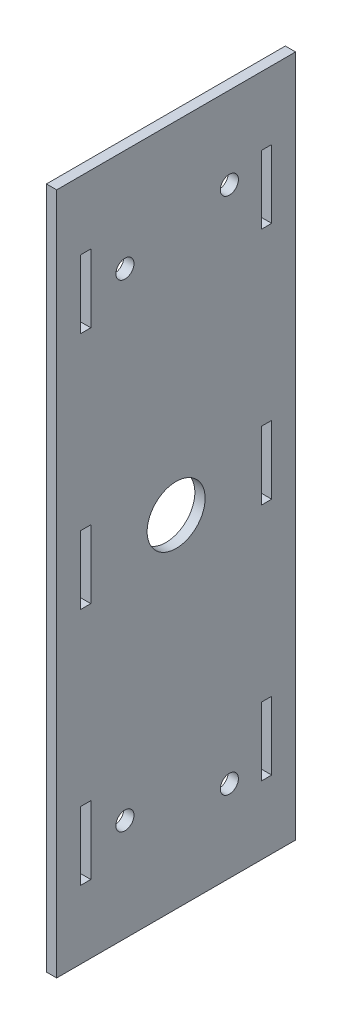
ISO-10303-21;
HEADER;
FILE_DESCRIPTION(('STEP AP214'),'2;1');
FILE_NAME('part.step','',(''),(''),'','','');
FILE_SCHEMA(('AUTOMOTIVE_DESIGN { 1 0 10303 214 1 1 1 1 }'));
ENDSEC;
DATA;
#1=APPLICATION_CONTEXT('core data for automotive mechanical design processes');
#2=APPLICATION_PROTOCOL_DEFINITION('international standard','automotive_design',2000,#1);
#3=PRODUCT_CONTEXT('',#1,'mechanical');
#4=PRODUCT('Part','Part','',(#3));
#5=PRODUCT_RELATED_PRODUCT_CATEGORY('part','',(#4));
#6=PRODUCT_DEFINITION_FORMATION('','',#4);
#7=PRODUCT_DEFINITION_CONTEXT('part definition',#1,'design');
#8=PRODUCT_DEFINITION('design','',#6,#7);
#9=PRODUCT_DEFINITION_SHAPE('','',#8);
#10=(LENGTH_UNIT() NAMED_UNIT(*) SI_UNIT(.MILLI.,.METRE.));
#11=(NAMED_UNIT(*) PLANE_ANGLE_UNIT() SI_UNIT($,.RADIAN.));
#12=(NAMED_UNIT(*) SI_UNIT($,.STERADIAN.) SOLID_ANGLE_UNIT());
#13=UNCERTAINTY_MEASURE_WITH_UNIT(LENGTH_MEASURE(1.E-05),#10,'distance_accuracy_value','');
#14=(GEOMETRIC_REPRESENTATION_CONTEXT(3) GLOBAL_UNCERTAINTY_ASSIGNED_CONTEXT((#13)) GLOBAL_UNIT_ASSIGNED_CONTEXT((#10,
#11,#12)) REPRESENTATION_CONTEXT('',''));
#15=CARTESIAN_POINT('',(0.,0.,0.));
#16=DIRECTION('',(0.,0.,1.));
#17=DIRECTION('',(1.,0.,0.));
#18=AXIS2_PLACEMENT_3D('',#15,#16,#17);
#19=CARTESIAN_POINT('',(3.,0.,0.));
#20=DIRECTION('',(1.,0.,0.));
#21=DIRECTION('',(0.,0.,-1.));
#22=AXIS2_PLACEMENT_3D('',#19,#20,#21);
#23=PLANE('',#22);
#24=CARTESIAN_POINT('',(3.,-70.,15.));
#25=DIRECTION('',(1.,0.,0.));
#26=DIRECTION('',(0.,0.,-1.));
#27=AXIS2_PLACEMENT_3D('',#24,#25,#26);
#28=CIRCLE('',#27,2.65);
#29=CARTESIAN_POINT('',(3.,-70.,12.35));
#30=VERTEX_POINT('',#29);
#31=EDGE_CURVE('E260',#30,#30,#28,.T.);
#32=ORIENTED_EDGE('',*,*,#31,.F.);
#33=EDGE_LOOP('',(#32));
#34=FACE_BOUND('',#33,.T.);
#35=DIRECTION('',(0.,1.,0.));
#36=VECTOR('',#35,1.);
#37=CARTESIAN_POINT('',(3.,-80.,-28.));
#38=LINE('',#37,#36);
#39=CARTESIAN_POINT('',(3.,-80.,-28.));
#40=VERTEX_POINT('',#39);
#41=CARTESIAN_POINT('',(3.,-60.,-28.));
#42=VERTEX_POINT('',#41);
#43=EDGE_CURVE('E397',#40,#42,#38,.T.);
#44=ORIENTED_EDGE('',*,*,#43,.F.);
#45=DIRECTION('',(0.,0.,-1.));
#46=VECTOR('',#45,1.);
#47=CARTESIAN_POINT('',(3.,-80.,-25.));
#48=LINE('',#47,#46);
#49=CARTESIAN_POINT('',(3.,-80.,-25.));
#50=VERTEX_POINT('',#49);
#51=EDGE_CURVE('E400',#50,#40,#48,.T.);
#52=ORIENTED_EDGE('',*,*,#51,.F.);
#53=DIRECTION('',(0.,-1.,0.));
#54=VECTOR('',#53,1.);
#55=CARTESIAN_POINT('',(3.,-80.,-25.));
#56=LINE('',#55,#54);
#57=CARTESIAN_POINT('',(3.,-60.,-25.));
#58=VERTEX_POINT('',#57);
#59=EDGE_CURVE('E403',#58,#50,#56,.T.);
#60=ORIENTED_EDGE('',*,*,#59,.F.);
#61=DIRECTION('',(0.,0.,1.));
#62=VECTOR('',#61,1.);
#63=CARTESIAN_POINT('',(3.,-60.,-25.));
#64=LINE('',#63,#62);
#65=EDGE_CURVE('E405',#42,#58,#64,.T.);
#66=ORIENTED_EDGE('',*,*,#65,.F.);
#67=EDGE_LOOP('',(#44,#52,#60,#66));
#68=FACE_BOUND('',#67,.T.);
#69=CARTESIAN_POINT('',(3.,-76.,-15.6));
#70=DIRECTION('',(1.,0.,0.));
#71=DIRECTION('',(0.,0.,-1.));
#72=AXIS2_PLACEMENT_3D('',#69,#70,#71);
#73=CIRCLE('',#72,2.65);
#74=CARTESIAN_POINT('',(3.,-76.,-18.25));
#75=VERTEX_POINT('',#74);
#76=EDGE_CURVE('E428',#75,#75,#73,.T.);
#77=ORIENTED_EDGE('',*,*,#76,.F.);
#78=EDGE_LOOP('',(#77));
#79=FACE_BOUND('',#78,.T.);
#80=DIRECTION('',(0.,0.,-1.));
#81=VECTOR('',#80,1.);
#82=CARTESIAN_POINT('',(3.,-100.,35.));
#83=LINE('',#82,#81);
#84=CARTESIAN_POINT('',(3.,-100.,35.));
#85=VERTEX_POINT('',#84);
#86=CARTESIAN_POINT('',(3.,-100.,-35.));
#87=VERTEX_POINT('',#86);
#88=EDGE_CURVE('E439',#85,#87,#83,.T.);
#89=ORIENTED_EDGE('',*,*,#88,.T.);
#90=DIRECTION('',(0.,1.,0.));
#91=VECTOR('',#90,1.);
#92=CARTESIAN_POINT('',(3.,-100.,-35.));
#93=LINE('',#92,#91);
#94=CARTESIAN_POINT('',(3.,100.,-35.));
#95=VERTEX_POINT('',#94);
#96=EDGE_CURVE('E444',#87,#95,#93,.T.);
#97=ORIENTED_EDGE('',*,*,#96,.T.);
#98=DIRECTION('',(0.,0.,1.));
#99=VECTOR('',#98,1.);
#100=CARTESIAN_POINT('',(3.,100.,35.));
#101=LINE('',#100,#99);
#102=CARTESIAN_POINT('',(3.,100.,35.));
#103=VERTEX_POINT('',#102);
#104=EDGE_CURVE('E447',#95,#103,#101,.T.);
#105=ORIENTED_EDGE('',*,*,#104,.T.);
#106=DIRECTION('',(0.,-1.,0.));
#107=VECTOR('',#106,1.);
#108=CARTESIAN_POINT('',(3.,-100.,35.));
#109=LINE('',#108,#107);
#110=EDGE_CURVE('E449',#103,#85,#109,.T.);
#111=ORIENTED_EDGE('',*,*,#110,.T.);
#112=EDGE_LOOP('',(#89,#97,#105,#111));
#113=FACE_BOUND('',#112,.T.);
#114=CARTESIAN_POINT('',(3.,0.,0.));
#115=DIRECTION('',(1.,0.,0.));
#116=DIRECTION('',(0.,0.,-1.));
#117=AXIS2_PLACEMENT_3D('',#114,#115,#116);
#118=CIRCLE('',#117,8.5);
#119=CARTESIAN_POINT('',(3.,0.,-8.5));
#120=VERTEX_POINT('',#119);
#121=EDGE_CURVE('E432',#120,#120,#118,.T.);
#122=ORIENTED_EDGE('',*,*,#121,.F.);
#123=EDGE_LOOP('',(#122));
#124=FACE_BOUND('',#123,.T.);
#125=CARTESIAN_POINT('',(3.,76.,-15.5999999999999));
#126=DIRECTION('',(1.,0.,0.));
#127=DIRECTION('',(0.,0.,1.));
#128=AXIS2_PLACEMENT_3D('',#125,#126,#127);
#129=CIRCLE('',#128,2.65);
#130=CARTESIAN_POINT('',(3.,76.,-12.9499999999999));
#131=VERTEX_POINT('',#130);
#132=EDGE_CURVE('E392',#131,#131,#129,.T.);
#133=ORIENTED_EDGE('',*,*,#132,.F.);
#134=EDGE_LOOP('',(#133));
#135=FACE_BOUND('',#134,.T.);
#136=DIRECTION('',(0.,-1.,0.));
#137=VECTOR('',#136,1.);
#138=CARTESIAN_POINT('',(3.,80.,-25.));
#139=LINE('',#138,#137);
#140=CARTESIAN_POINT('',(3.,80.,-25.));
#141=VERTEX_POINT('',#140);
#142=CARTESIAN_POINT('',(3.,60.,-25.));
#143=VERTEX_POINT('',#142);
#144=EDGE_CURVE('E362',#141,#143,#139,.T.);
#145=ORIENTED_EDGE('',*,*,#144,.F.);
#146=DIRECTION('',(0.,0.,1.));
#147=VECTOR('',#146,1.);
#148=CARTESIAN_POINT('',(3.,80.,-25.));
#149=LINE('',#148,#147);
#150=CARTESIAN_POINT('',(3.,80.,-28.));
#151=VERTEX_POINT('',#150);
#152=EDGE_CURVE('E359',#151,#141,#149,.T.);
#153=ORIENTED_EDGE('',*,*,#152,.F.);
#154=DIRECTION('',(0.,1.,0.));
#155=VECTOR('',#154,1.);
#156=CARTESIAN_POINT('',(3.,80.,-28.));
#157=LINE('',#156,#155);
#158=CARTESIAN_POINT('',(3.,60.,-28.));
#159=VERTEX_POINT('',#158);
#160=EDGE_CURVE('E366',#159,#151,#157,.T.);
#161=ORIENTED_EDGE('',*,*,#160,.F.);
#162=DIRECTION('',(0.,0.,-1.));
#163=VECTOR('',#162,1.);
#164=CARTESIAN_POINT('',(3.,60.,-25.));
#165=LINE('',#164,#163);
#166=EDGE_CURVE('E364',#143,#159,#165,.T.);
#167=ORIENTED_EDGE('',*,*,#166,.F.);
#168=EDGE_LOOP('',(#145,#153,#161,#167));
#169=FACE_BOUND('',#168,.T.);
#170=DIRECTION('',(0.,1.,0.));
#171=VECTOR('',#170,1.);
#172=CARTESIAN_POINT('',(3.,-10.,-28.));
#173=LINE('',#172,#171);
#174=CARTESIAN_POINT('',(3.,-10.,-28.));
#175=VERTEX_POINT('',#174);
#176=CARTESIAN_POINT('',(3.,10.,-28.));
#177=VERTEX_POINT('',#176);
#178=EDGE_CURVE('E332',#175,#177,#173,.T.);
#179=ORIENTED_EDGE('',*,*,#178,.F.);
#180=DIRECTION('',(0.,0.,-1.));
#181=VECTOR('',#180,1.);
#182=CARTESIAN_POINT('',(3.,-10.,-25.));
#183=LINE('',#182,#181);
#184=CARTESIAN_POINT('',(3.,-10.,-25.));
#185=VERTEX_POINT('',#184);
#186=EDGE_CURVE('E328',#185,#175,#183,.T.);
#187=ORIENTED_EDGE('',*,*,#186,.F.);
#188=DIRECTION('',(0.,-1.,0.));
#189=VECTOR('',#188,1.);
#190=CARTESIAN_POINT('',(3.,-10.,-25.));
#191=LINE('',#190,#189);
#192=CARTESIAN_POINT('',(3.,10.,-25.));
#193=VERTEX_POINT('',#192);
#194=EDGE_CURVE('E340',#193,#185,#191,.T.);
#195=ORIENTED_EDGE('',*,*,#194,.F.);
#196=DIRECTION('',(0.,0.,1.));
#197=VECTOR('',#196,1.);
#198=CARTESIAN_POINT('',(3.,10.,-25.));
#199=LINE('',#198,#197);
#200=EDGE_CURVE('E331',#177,#193,#199,.T.);
#201=ORIENTED_EDGE('',*,*,#200,.F.);
#202=EDGE_LOOP('',(#179,#187,#195,#201));
#203=FACE_BOUND('',#202,.T.);
#204=DIRECTION('',(0.,0.,1.));
#205=VECTOR('',#204,1.);
#206=CARTESIAN_POINT('',(3.,80.,25.));
#207=LINE('',#206,#205);
#208=CARTESIAN_POINT('',(3.,80.,25.));
#209=VERTEX_POINT('',#208);
#210=CARTESIAN_POINT('',(3.,80.,28.));
#211=VERTEX_POINT('',#210);
#212=EDGE_CURVE('E298',#209,#211,#207,.T.);
#213=ORIENTED_EDGE('',*,*,#212,.F.);
#214=DIRECTION('',(0.,1.,0.));
#215=VECTOR('',#214,1.);
#216=CARTESIAN_POINT('',(3.,80.,25.));
#217=LINE('',#216,#215);
#218=CARTESIAN_POINT('',(3.,60.,25.));
#219=VERTEX_POINT('',#218);
#220=EDGE_CURVE('E299',#219,#209,#217,.T.);
#221=ORIENTED_EDGE('',*,*,#220,.F.);
#222=DIRECTION('',(0.,0.,-1.));
#223=VECTOR('',#222,1.);
#224=CARTESIAN_POINT('',(3.,60.,25.));
#225=LINE('',#224,#223);
#226=CARTESIAN_POINT('',(3.,60.,28.));
#227=VERTEX_POINT('',#226);
#228=EDGE_CURVE('E308',#227,#219,#225,.T.);
#229=ORIENTED_EDGE('',*,*,#228,.F.);
#230=DIRECTION('',(0.,-1.,0.));
#231=VECTOR('',#230,1.);
#232=CARTESIAN_POINT('',(3.,80.,28.));
#233=LINE('',#232,#231);
#234=EDGE_CURVE('E303',#211,#227,#233,.T.);
#235=ORIENTED_EDGE('',*,*,#234,.F.);
#236=EDGE_LOOP('',(#213,#221,#229,#235));
#237=FACE_BOUND('',#236,.T.);
#238=DIRECTION('',(0.,1.,0.));
#239=VECTOR('',#238,1.);
#240=CARTESIAN_POINT('',(3.,-10.,25.));
#241=LINE('',#240,#239);
#242=CARTESIAN_POINT('',(3.,-10.,25.));
#243=VERTEX_POINT('',#242);
#244=CARTESIAN_POINT('',(3.,10.,25.));
#245=VERTEX_POINT('',#244);
#246=EDGE_CURVE('E267',#243,#245,#241,.T.);
#247=ORIENTED_EDGE('',*,*,#246,.F.);
#248=DIRECTION('',(0.,0.,-1.));
#249=VECTOR('',#248,1.);
#250=CARTESIAN_POINT('',(3.,-10.,25.));
#251=LINE('',#250,#249);
#252=CARTESIAN_POINT('',(3.,-10.,28.));
#253=VERTEX_POINT('',#252);
#254=EDGE_CURVE('E270',#253,#243,#251,.T.);
#255=ORIENTED_EDGE('',*,*,#254,.F.);
#256=DIRECTION('',(0.,-1.,0.));
#257=VECTOR('',#256,1.);
#258=CARTESIAN_POINT('',(3.,-10.,28.));
#259=LINE('',#258,#257);
#260=CARTESIAN_POINT('',(3.,10.,28.));
#261=VERTEX_POINT('',#260);
#262=EDGE_CURVE('E274',#261,#253,#259,.T.);
#263=ORIENTED_EDGE('',*,*,#262,.F.);
#264=DIRECTION('',(0.,0.,1.));
#265=VECTOR('',#264,1.);
#266=CARTESIAN_POINT('',(3.,10.,25.));
#267=LINE('',#266,#265);
#268=EDGE_CURVE('E275',#245,#261,#267,.T.);
#269=ORIENTED_EDGE('',*,*,#268,.F.);
#270=EDGE_LOOP('',(#247,#255,#263,#269));
#271=FACE_BOUND('',#270,.T.);
#272=DIRECTION('',(0.,1.,0.));
#273=VECTOR('',#272,1.);
#274=CARTESIAN_POINT('',(3.,-80.,25.));
#275=LINE('',#274,#273);
#276=CARTESIAN_POINT('',(3.,-80.,25.));
#277=VERTEX_POINT('',#276);
#278=CARTESIAN_POINT('',(3.,-60.,25.));
#279=VERTEX_POINT('',#278);
#280=EDGE_CURVE('E237',#277,#279,#275,.T.);
#281=ORIENTED_EDGE('',*,*,#280,.F.);
#282=DIRECTION('',(0.,0.,-1.));
#283=VECTOR('',#282,1.);
#284=CARTESIAN_POINT('',(3.,-80.,25.));
#285=LINE('',#284,#283);
#286=CARTESIAN_POINT('',(3.,-80.,28.));
#287=VERTEX_POINT('',#286);
#288=EDGE_CURVE('E229',#287,#277,#285,.T.);
#289=ORIENTED_EDGE('',*,*,#288,.F.);
#290=DIRECTION('',(0.,-1.,0.));
#291=VECTOR('',#290,1.);
#292=CARTESIAN_POINT('',(3.,-80.,28.));
#293=LINE('',#292,#291);
#294=CARTESIAN_POINT('',(3.,-60.,28.));
#295=VERTEX_POINT('',#294);
#296=EDGE_CURVE('E253',#295,#287,#293,.T.);
#297=ORIENTED_EDGE('',*,*,#296,.F.);
#298=DIRECTION('',(0.,0.,1.));
#299=VECTOR('',#298,1.);
#300=CARTESIAN_POINT('',(3.,-60.,25.));
#301=LINE('',#300,#299);
#302=EDGE_CURVE('E247',#279,#295,#301,.T.);
#303=ORIENTED_EDGE('',*,*,#302,.F.);
#304=EDGE_LOOP('',(#281,#289,#297,#303));
#305=FACE_BOUND('',#304,.T.);
#306=CARTESIAN_POINT('',(3.,70.,15.));
#307=DIRECTION('',(1.,0.,0.));
#308=DIRECTION('',(0.,0.,1.));
#309=AXIS2_PLACEMENT_3D('',#306,#307,#308);
#310=CIRCLE('',#309,2.65);
#311=CARTESIAN_POINT('',(3.,70.,17.65));
#312=VERTEX_POINT('',#311);
#313=EDGE_CURVE('E531',#312,#312,#310,.T.);
#314=ORIENTED_EDGE('',*,*,#313,.F.);
#315=EDGE_LOOP('',(#314));
#316=FACE_BOUND('',#315,.T.);
#317=ADVANCED_FACE('F43',(#34,#68,#79,#113,#124,#135,#169,#203,#237,#271,#305,#316),#23,.T.);
#318=CARTESIAN_POINT('',(0.,0.,0.));
#319=DIRECTION('',(1.,0.,0.));
#320=DIRECTION('',(0.,0.,-1.));
#321=AXIS2_PLACEMENT_3D('',#318,#319,#320);
#322=PLANE('',#321);
#323=DIRECTION('',(0.,0.,-1.));
#324=VECTOR('',#323,1.);
#325=CARTESIAN_POINT('',(0.,-10.,25.));
#326=LINE('',#325,#324);
#327=CARTESIAN_POINT('',(0.,-10.,28.));
#328=VERTEX_POINT('',#327);
#329=CARTESIAN_POINT('',(0.,-10.,25.));
#330=VERTEX_POINT('',#329);
#331=EDGE_CURVE('E241',#328,#330,#326,.T.);
#332=ORIENTED_EDGE('',*,*,#331,.T.);
#333=DIRECTION('',(0.,1.,0.));
#334=VECTOR('',#333,1.);
#335=CARTESIAN_POINT('',(0.,-10.,25.));
#336=LINE('',#335,#334);
#337=CARTESIAN_POINT('',(0.,10.,25.));
#338=VERTEX_POINT('',#337);
#339=EDGE_CURVE('E278',#330,#338,#336,.T.);
#340=ORIENTED_EDGE('',*,*,#339,.T.);
#341=DIRECTION('',(0.,0.,1.));
#342=VECTOR('',#341,1.);
#343=CARTESIAN_POINT('',(0.,10.,25.));
#344=LINE('',#343,#342);
#345=CARTESIAN_POINT('',(0.,10.,28.));
#346=VERTEX_POINT('',#345);
#347=EDGE_CURVE('E284',#338,#346,#344,.T.);
#348=ORIENTED_EDGE('',*,*,#347,.T.);
#349=DIRECTION('',(0.,-1.,0.));
#350=VECTOR('',#349,1.);
#351=CARTESIAN_POINT('',(0.,-10.,28.));
#352=LINE('',#351,#350);
#353=EDGE_CURVE('E269',#346,#328,#352,.T.);
#354=ORIENTED_EDGE('',*,*,#353,.T.);
#355=EDGE_LOOP('',(#332,#340,#348,#354));
#356=FACE_BOUND('',#355,.T.);
#357=DIRECTION('',(0.,0.,-1.));
#358=VECTOR('',#357,1.);
#359=CARTESIAN_POINT('',(0.,-10.,-25.));
#360=LINE('',#359,#358);
#361=CARTESIAN_POINT('',(0.,-10.,-25.));
#362=VERTEX_POINT('',#361);
#363=CARTESIAN_POINT('',(0.,-10.,-28.));
#364=VERTEX_POINT('',#363);
#365=EDGE_CURVE('E327',#362,#364,#360,.T.);
#366=ORIENTED_EDGE('',*,*,#365,.T.);
#367=DIRECTION('',(0.,1.,0.));
#368=VECTOR('',#367,1.);
#369=CARTESIAN_POINT('',(0.,-10.,-28.));
#370=LINE('',#369,#368);
#371=CARTESIAN_POINT('',(0.,10.,-28.));
#372=VERTEX_POINT('',#371);
#373=EDGE_CURVE('E345',#364,#372,#370,.T.);
#374=ORIENTED_EDGE('',*,*,#373,.T.);
#375=DIRECTION('',(0.,0.,1.));
#376=VECTOR('',#375,1.);
#377=CARTESIAN_POINT('',(0.,10.,-25.));
#378=LINE('',#377,#376);
#379=CARTESIAN_POINT('',(0.,10.,-25.));
#380=VERTEX_POINT('',#379);
#381=EDGE_CURVE('E344',#372,#380,#378,.T.);
#382=ORIENTED_EDGE('',*,*,#381,.T.);
#383=DIRECTION('',(0.,-1.,0.));
#384=VECTOR('',#383,1.);
#385=CARTESIAN_POINT('',(0.,-10.,-25.));
#386=LINE('',#385,#384);
#387=EDGE_CURVE('E335',#380,#362,#386,.T.);
#388=ORIENTED_EDGE('',*,*,#387,.T.);
#389=EDGE_LOOP('',(#366,#374,#382,#388));
#390=FACE_BOUND('',#389,.T.);
#391=CARTESIAN_POINT('',(0.,76.,-15.5999999999999));
#392=DIRECTION('',(1.,0.,0.));
#393=DIRECTION('',(0.,0.,1.));
#394=AXIS2_PLACEMENT_3D('',#391,#392,#393);
#395=CIRCLE('',#394,2.65);
#396=CARTESIAN_POINT('',(0.,76.,-12.9499999999999));
#397=VERTEX_POINT('',#396);
#398=EDGE_CURVE('E388',#397,#397,#395,.T.);
#399=ORIENTED_EDGE('',*,*,#398,.T.);
#400=EDGE_LOOP('',(#399));
#401=FACE_BOUND('',#400,.T.);
#402=DIRECTION('',(0.,0.,-1.));
#403=VECTOR('',#402,1.);
#404=CARTESIAN_POINT('',(0.,-80.,-25.));
#405=LINE('',#404,#403);
#406=CARTESIAN_POINT('',(0.,-80.,-25.));
#407=VERTEX_POINT('',#406);
#408=CARTESIAN_POINT('',(0.,-80.,-28.));
#409=VERTEX_POINT('',#408);
#410=EDGE_CURVE('E391',#407,#409,#405,.T.);
#411=ORIENTED_EDGE('',*,*,#410,.T.);
#412=DIRECTION('',(0.,1.,0.));
#413=VECTOR('',#412,1.);
#414=CARTESIAN_POINT('',(0.,-80.,-28.));
#415=LINE('',#414,#413);
#416=CARTESIAN_POINT('',(0.,-60.,-28.));
#417=VERTEX_POINT('',#416);
#418=EDGE_CURVE('E408',#409,#417,#415,.T.);
#419=ORIENTED_EDGE('',*,*,#418,.T.);
#420=DIRECTION('',(0.,0.,1.));
#421=VECTOR('',#420,1.);
#422=CARTESIAN_POINT('',(0.,-60.,-25.));
#423=LINE('',#422,#421);
#424=CARTESIAN_POINT('',(0.,-60.,-25.));
#425=VERTEX_POINT('',#424);
#426=EDGE_CURVE('E413',#417,#425,#423,.T.);
#427=ORIENTED_EDGE('',*,*,#426,.T.);
#428=DIRECTION('',(0.,-1.,0.));
#429=VECTOR('',#428,1.);
#430=CARTESIAN_POINT('',(0.,-80.,-25.));
#431=LINE('',#430,#429);
#432=EDGE_CURVE('E399',#425,#407,#431,.T.);
#433=ORIENTED_EDGE('',*,*,#432,.T.);
#434=EDGE_LOOP('',(#411,#419,#427,#433));
#435=FACE_BOUND('',#434,.T.);
#436=DIRECTION('',(0.,0.,-1.));
#437=VECTOR('',#436,1.);
#438=CARTESIAN_POINT('',(0.,-100.,35.));
#439=LINE('',#438,#437);
#440=CARTESIAN_POINT('',(0.,-100.,35.));
#441=VERTEX_POINT('',#440);
#442=CARTESIAN_POINT('',(0.,-100.,-35.));
#443=VERTEX_POINT('',#442);
#444=EDGE_CURVE('E440',#441,#443,#439,.T.);
#445=ORIENTED_EDGE('',*,*,#444,.F.);
#446=DIRECTION('',(0.,-1.,0.));
#447=VECTOR('',#446,1.);
#448=CARTESIAN_POINT('',(0.,-100.,35.));
#449=LINE('',#448,#447);
#450=CARTESIAN_POINT('',(0.,100.,35.));
#451=VERTEX_POINT('',#450);
#452=EDGE_CURVE('E441',#451,#441,#449,.T.);
#453=ORIENTED_EDGE('',*,*,#452,.F.);
#454=DIRECTION('',(0.,0.,1.));
#455=VECTOR('',#454,1.);
#456=CARTESIAN_POINT('',(0.,100.,35.));
#457=LINE('',#456,#455);
#458=CARTESIAN_POINT('',(0.,100.,-35.));
#459=VERTEX_POINT('',#458);
#460=EDGE_CURVE('E454',#459,#451,#457,.T.);
#461=ORIENTED_EDGE('',*,*,#460,.F.);
#462=DIRECTION('',(0.,1.,0.));
#463=VECTOR('',#462,1.);
#464=CARTESIAN_POINT('',(0.,-100.,-35.));
#465=LINE('',#464,#463);
#466=EDGE_CURVE('E453',#443,#459,#465,.T.);
#467=ORIENTED_EDGE('',*,*,#466,.F.);
#468=EDGE_LOOP('',(#445,#453,#461,#467));
#469=FACE_BOUND('',#468,.T.);
#470=CARTESIAN_POINT('',(0.,0.,0.));
#471=DIRECTION('',(1.,0.,0.));
#472=DIRECTION('',(0.,0.,-1.));
#473=AXIS2_PLACEMENT_3D('',#470,#471,#472);
#474=CIRCLE('',#473,8.5);
#475=CARTESIAN_POINT('',(0.,0.,-8.5));
#476=VERTEX_POINT('',#475);
#477=EDGE_CURVE('E431',#476,#476,#474,.T.);
#478=ORIENTED_EDGE('',*,*,#477,.T.);
#479=EDGE_LOOP('',(#478));
#480=FACE_BOUND('',#479,.T.);
#481=CARTESIAN_POINT('',(0.,-76.,-15.6));
#482=DIRECTION('',(1.,0.,0.));
#483=DIRECTION('',(0.,0.,-1.));
#484=AXIS2_PLACEMENT_3D('',#481,#482,#483);
#485=CIRCLE('',#484,2.65);
#486=CARTESIAN_POINT('',(0.,-76.,-18.25));
#487=VERTEX_POINT('',#486);
#488=EDGE_CURVE('E430',#487,#487,#485,.T.);
#489=ORIENTED_EDGE('',*,*,#488,.T.);
#490=EDGE_LOOP('',(#489));
#491=FACE_BOUND('',#490,.T.);
#492=DIRECTION('',(0.,0.,1.));
#493=VECTOR('',#492,1.);
#494=CARTESIAN_POINT('',(0.,80.,-25.));
#495=LINE('',#494,#493);
#496=CARTESIAN_POINT('',(0.,80.,-28.));
#497=VERTEX_POINT('',#496);
#498=CARTESIAN_POINT('',(0.,80.,-25.));
#499=VERTEX_POINT('',#498);
#500=EDGE_CURVE('E357',#497,#499,#495,.T.);
#501=ORIENTED_EDGE('',*,*,#500,.T.);
#502=DIRECTION('',(0.,-1.,0.));
#503=VECTOR('',#502,1.);
#504=CARTESIAN_POINT('',(0.,80.,-25.));
#505=LINE('',#504,#503);
#506=CARTESIAN_POINT('',(0.,60.,-25.));
#507=VERTEX_POINT('',#506);
#508=EDGE_CURVE('E373',#499,#507,#505,.T.);
#509=ORIENTED_EDGE('',*,*,#508,.T.);
#510=DIRECTION('',(0.,0.,-1.));
#511=VECTOR('',#510,1.);
#512=CARTESIAN_POINT('',(0.,60.,-25.));
#513=LINE('',#512,#511);
#514=CARTESIAN_POINT('',(0.,60.,-28.));
#515=VERTEX_POINT('',#514);
#516=EDGE_CURVE('E376',#507,#515,#513,.T.);
#517=ORIENTED_EDGE('',*,*,#516,.T.);
#518=DIRECTION('',(0.,1.,0.));
#519=VECTOR('',#518,1.);
#520=CARTESIAN_POINT('',(0.,80.,-28.));
#521=LINE('',#520,#519);
#522=EDGE_CURVE('E361',#515,#497,#521,.T.);
#523=ORIENTED_EDGE('',*,*,#522,.T.);
#524=EDGE_LOOP('',(#501,#509,#517,#523));
#525=FACE_BOUND('',#524,.T.);
#526=DIRECTION('',(0.,1.,0.));
#527=VECTOR('',#526,1.);
#528=CARTESIAN_POINT('',(0.,80.,25.));
#529=LINE('',#528,#527);
#530=CARTESIAN_POINT('',(0.,60.,25.));
#531=VERTEX_POINT('',#530);
#532=CARTESIAN_POINT('',(0.,80.,25.));
#533=VERTEX_POINT('',#532);
#534=EDGE_CURVE('E300',#531,#533,#529,.T.);
#535=ORIENTED_EDGE('',*,*,#534,.T.);
#536=DIRECTION('',(0.,0.,1.));
#537=VECTOR('',#536,1.);
#538=CARTESIAN_POINT('',(0.,80.,25.));
#539=LINE('',#538,#537);
#540=CARTESIAN_POINT('',(0.,80.,28.));
#541=VERTEX_POINT('',#540);
#542=EDGE_CURVE('E313',#533,#541,#539,.T.);
#543=ORIENTED_EDGE('',*,*,#542,.T.);
#544=DIRECTION('',(0.,-1.,0.));
#545=VECTOR('',#544,1.);
#546=CARTESIAN_POINT('',(0.,80.,28.));
#547=LINE('',#546,#545);
#548=CARTESIAN_POINT('',(0.,60.,28.));
#549=VERTEX_POINT('',#548);
#550=EDGE_CURVE('E314',#541,#549,#547,.T.);
#551=ORIENTED_EDGE('',*,*,#550,.T.);
#552=DIRECTION('',(0.,0.,-1.));
#553=VECTOR('',#552,1.);
#554=CARTESIAN_POINT('',(0.,60.,25.));
#555=LINE('',#554,#553);
#556=EDGE_CURVE('E301',#549,#531,#555,.T.);
#557=ORIENTED_EDGE('',*,*,#556,.T.);
#558=EDGE_LOOP('',(#535,#543,#551,#557));
#559=FACE_BOUND('',#558,.T.);
#560=DIRECTION('',(0.,0.,-1.));
#561=VECTOR('',#560,1.);
#562=CARTESIAN_POINT('',(0.,-80.,25.));
#563=LINE('',#562,#561);
#564=CARTESIAN_POINT('',(0.,-80.,28.));
#565=VERTEX_POINT('',#564);
#566=CARTESIAN_POINT('',(0.,-80.,25.));
#567=VERTEX_POINT('',#566);
#568=EDGE_CURVE('E66',#565,#567,#563,.T.);
#569=ORIENTED_EDGE('',*,*,#568,.T.);
#570=DIRECTION('',(0.,1.,0.));
#571=VECTOR('',#570,1.);
#572=CARTESIAN_POINT('',(0.,-80.,25.));
#573=LINE('',#572,#571);
#574=CARTESIAN_POINT('',(0.,-60.,25.));
#575=VERTEX_POINT('',#574);
#576=EDGE_CURVE('E244',#567,#575,#573,.T.);
#577=ORIENTED_EDGE('',*,*,#576,.T.);
#578=DIRECTION('',(0.,0.,1.));
#579=VECTOR('',#578,1.);
#580=CARTESIAN_POINT('',(0.,-60.,25.));
#581=LINE('',#580,#579);
#582=CARTESIAN_POINT('',(0.,-60.,28.));
#583=VERTEX_POINT('',#582);
#584=EDGE_CURVE('E259',#575,#583,#581,.T.);
#585=ORIENTED_EDGE('',*,*,#584,.T.);
#586=DIRECTION('',(0.,-1.,0.));
#587=VECTOR('',#586,1.);
#588=CARTESIAN_POINT('',(0.,-80.,28.));
#589=LINE('',#588,#587);
#590=EDGE_CURVE('E240',#583,#565,#589,.T.);
#591=ORIENTED_EDGE('',*,*,#590,.T.);
#592=EDGE_LOOP('',(#569,#577,#585,#591));
#593=FACE_BOUND('',#592,.T.);
#594=CARTESIAN_POINT('',(0.,-70.,15.));
#595=DIRECTION('',(1.,0.,0.));
#596=DIRECTION('',(0.,0.,-1.));
#597=AXIS2_PLACEMENT_3D('',#594,#595,#596);
#598=CIRCLE('',#597,2.65);
#599=CARTESIAN_POINT('',(0.,-70.,12.35));
#600=VERTEX_POINT('',#599);
#601=EDGE_CURVE('E526',#600,#600,#598,.T.);
#602=ORIENTED_EDGE('',*,*,#601,.T.);
#603=EDGE_LOOP('',(#602));
#604=FACE_BOUND('',#603,.T.);
#605=CARTESIAN_POINT('',(0.,70.,15.));
#606=DIRECTION('',(1.,0.,0.));
#607=DIRECTION('',(0.,0.,1.));
#608=AXIS2_PLACEMENT_3D('',#605,#606,#607);
#609=CIRCLE('',#608,2.65);
#610=CARTESIAN_POINT('',(0.,70.,17.65));
#611=VERTEX_POINT('',#610);
#612=EDGE_CURVE('E533',#611,#611,#609,.T.);
#613=ORIENTED_EDGE('',*,*,#612,.T.);
#614=EDGE_LOOP('',(#613));
#615=FACE_BOUND('',#614,.T.);
#616=ADVANCED_FACE('F471',(#356,#390,#401,#435,#469,#480,#491,#525,#559,#593,#604,#615),#322,.F.);
#617=CARTESIAN_POINT('',(3.,-100.,35.));
#618=DIRECTION('',(0.,1.,0.));
#619=DIRECTION('',(0.,0.,1.));
#620=AXIS2_PLACEMENT_3D('',#617,#618,#619);
#621=PLANE('',#620);
#622=ORIENTED_EDGE('',*,*,#444,.T.);
#623=DIRECTION('',(-1.,0.,0.));
#624=VECTOR('',#623,1.);
#625=CARTESIAN_POINT('',(3.,-100.,-35.));
#626=LINE('',#625,#624);
#627=EDGE_CURVE('E11',#87,#443,#626,.T.);
#628=ORIENTED_EDGE('',*,*,#627,.F.);
#629=ORIENTED_EDGE('',*,*,#88,.F.);
#630=DIRECTION('',(-1.,0.,0.));
#631=VECTOR('',#630,1.);
#632=CARTESIAN_POINT('',(3.,-100.,35.));
#633=LINE('',#632,#631);
#634=EDGE_CURVE('E448',#85,#441,#633,.T.);
#635=ORIENTED_EDGE('',*,*,#634,.T.);
#636=EDGE_LOOP('',(#622,#628,#629,#635));
#637=FACE_BOUND('',#636,.T.);
#638=ADVANCED_FACE('F44',(#637),#621,.F.);
#639=CARTESIAN_POINT('',(3.,-100.,-35.));
#640=DIRECTION('',(0.,0.,1.));
#641=DIRECTION('',(1.,0.,0.));
#642=AXIS2_PLACEMENT_3D('',#639,#640,#641);
#643=PLANE('',#642);
#644=ORIENTED_EDGE('',*,*,#466,.T.);
#645=DIRECTION('',(-1.,0.,0.));
#646=VECTOR('',#645,1.);
#647=CARTESIAN_POINT('',(3.,100.,-35.));
#648=LINE('',#647,#646);
#649=EDGE_CURVE('E51',#95,#459,#648,.T.);
#650=ORIENTED_EDGE('',*,*,#649,.F.);
#651=ORIENTED_EDGE('',*,*,#96,.F.);
#652=ORIENTED_EDGE('',*,*,#627,.T.);
#653=EDGE_LOOP('',(#644,#650,#651,#652));
#654=FACE_BOUND('',#653,.T.);
#655=ADVANCED_FACE('F482',(#654),#643,.F.);
#656=CARTESIAN_POINT('',(3.,100.,35.));
#657=DIRECTION('',(0.,-1.,0.));
#658=DIRECTION('',(0.,0.,-1.));
#659=AXIS2_PLACEMENT_3D('',#656,#657,#658);
#660=PLANE('',#659);
#661=ORIENTED_EDGE('',*,*,#460,.T.);
#662=DIRECTION('',(-1.,0.,0.));
#663=VECTOR('',#662,1.);
#664=CARTESIAN_POINT('',(3.,100.,35.));
#665=LINE('',#664,#663);
#666=EDGE_CURVE('E458',#103,#451,#665,.T.);
#667=ORIENTED_EDGE('',*,*,#666,.F.);
#668=ORIENTED_EDGE('',*,*,#104,.F.);
#669=ORIENTED_EDGE('',*,*,#649,.T.);
#670=EDGE_LOOP('',(#661,#667,#668,#669));
#671=FACE_BOUND('',#670,.T.);
#672=ADVANCED_FACE('F470',(#671),#660,.F.);
#673=CARTESIAN_POINT('',(3.,-100.,35.));
#674=DIRECTION('',(0.,0.,-1.));
#675=DIRECTION('',(-1.,0.,0.));
#676=AXIS2_PLACEMENT_3D('',#673,#674,#675);
#677=PLANE('',#676);
#678=ORIENTED_EDGE('',*,*,#452,.T.);
#679=ORIENTED_EDGE('',*,*,#634,.F.);
#680=ORIENTED_EDGE('',*,*,#110,.F.);
#681=ORIENTED_EDGE('',*,*,#666,.T.);
#682=EDGE_LOOP('',(#678,#679,#680,#681));
#683=FACE_BOUND('',#682,.T.);
#684=ADVANCED_FACE('F480',(#683),#677,.F.);
#685=CARTESIAN_POINT('',(3.,0.,0.));
#686=DIRECTION('',(-1.,0.,0.));
#687=DIRECTION('',(0.,0.,1.));
#688=AXIS2_PLACEMENT_3D('',#685,#686,#687);
#689=CYLINDRICAL_SURFACE('',#688,8.5);
#690=ORIENTED_EDGE('',*,*,#121,.T.);
#691=EDGE_LOOP('',(#690));
#692=FACE_BOUND('',#691,.T.);
#693=ORIENTED_EDGE('',*,*,#477,.F.);
#694=EDGE_LOOP('',(#693));
#695=FACE_BOUND('',#694,.T.);
#696=ADVANCED_FACE('F505',(#692,#695),#689,.F.);
#697=CARTESIAN_POINT('',(3.,-76.,-15.6));
#698=DIRECTION('',(-1.,0.,0.));
#699=DIRECTION('',(0.,0.,1.));
#700=AXIS2_PLACEMENT_3D('',#697,#698,#699);
#701=CYLINDRICAL_SURFACE('',#700,2.65);
#702=ORIENTED_EDGE('',*,*,#76,.T.);
#703=EDGE_LOOP('',(#702));
#704=FACE_BOUND('',#703,.T.);
#705=ORIENTED_EDGE('',*,*,#488,.F.);
#706=EDGE_LOOP('',(#705));
#707=FACE_BOUND('',#706,.T.);
#708=ADVANCED_FACE('F507',(#704,#707),#701,.F.);
#709=CARTESIAN_POINT('',(3.,-80.,-25.));
#710=DIRECTION('',(0.,1.,0.));
#711=DIRECTION('',(0.,0.,1.));
#712=AXIS2_PLACEMENT_3D('',#709,#710,#711);
#713=PLANE('',#712);
#714=ORIENTED_EDGE('',*,*,#410,.F.);
#715=DIRECTION('',(-1.,0.,0.));
#716=VECTOR('',#715,1.);
#717=CARTESIAN_POINT('',(3.,-80.,-25.));
#718=LINE('',#717,#716);
#719=EDGE_CURVE('E410',#50,#407,#718,.T.);
#720=ORIENTED_EDGE('',*,*,#719,.F.);
#721=ORIENTED_EDGE('',*,*,#51,.T.);
#722=DIRECTION('',(-1.,0.,0.));
#723=VECTOR('',#722,1.);
#724=CARTESIAN_POINT('',(3.,-80.,-28.));
#725=LINE('',#724,#723);
#726=EDGE_CURVE('E424',#40,#409,#725,.T.);
#727=ORIENTED_EDGE('',*,*,#726,.T.);
#728=EDGE_LOOP('',(#714,#720,#721,#727));
#729=FACE_BOUND('',#728,.T.);
#730=ADVANCED_FACE('F514',(#729),#713,.T.);
#731=CARTESIAN_POINT('',(3.,-80.,-28.));
#732=DIRECTION('',(0.,0.,1.));
#733=DIRECTION('',(1.,0.,0.));
#734=AXIS2_PLACEMENT_3D('',#731,#732,#733);
#735=PLANE('',#734);
#736=ORIENTED_EDGE('',*,*,#418,.F.);
#737=ORIENTED_EDGE('',*,*,#726,.F.);
#738=ORIENTED_EDGE('',*,*,#43,.T.);
#739=DIRECTION('',(-1.,0.,0.));
#740=VECTOR('',#739,1.);
#741=CARTESIAN_POINT('',(3.,-60.,-28.));
#742=LINE('',#741,#740);
#743=EDGE_CURVE('E425',#42,#417,#742,.T.);
#744=ORIENTED_EDGE('',*,*,#743,.T.);
#745=EDGE_LOOP('',(#736,#737,#738,#744));
#746=FACE_BOUND('',#745,.T.);
#747=ADVANCED_FACE('F637',(#746),#735,.T.);
#748=CARTESIAN_POINT('',(3.,-60.,-25.));
#749=DIRECTION('',(0.,-1.,0.));
#750=DIRECTION('',(0.,0.,-1.));
#751=AXIS2_PLACEMENT_3D('',#748,#749,#750);
#752=PLANE('',#751);
#753=ORIENTED_EDGE('',*,*,#426,.F.);
#754=ORIENTED_EDGE('',*,*,#743,.F.);
#755=ORIENTED_EDGE('',*,*,#65,.T.);
#756=DIRECTION('',(-1.,0.,0.));
#757=VECTOR('',#756,1.);
#758=CARTESIAN_POINT('',(3.,-60.,-25.));
#759=LINE('',#758,#757);
#760=EDGE_CURVE('E419',#58,#425,#759,.T.);
#761=ORIENTED_EDGE('',*,*,#760,.T.);
#762=EDGE_LOOP('',(#753,#754,#755,#761));
#763=FACE_BOUND('',#762,.T.);
#764=ADVANCED_FACE('F633',(#763),#752,.T.);
#765=CARTESIAN_POINT('',(3.,-80.,-25.));
#766=DIRECTION('',(0.,0.,-1.));
#767=DIRECTION('',(0.,1.,0.));
#768=AXIS2_PLACEMENT_3D('',#765,#766,#767);
#769=PLANE('',#768);
#770=ORIENTED_EDGE('',*,*,#432,.F.);
#771=ORIENTED_EDGE('',*,*,#760,.F.);
#772=ORIENTED_EDGE('',*,*,#59,.T.);
#773=ORIENTED_EDGE('',*,*,#719,.T.);
#774=EDGE_LOOP('',(#770,#771,#772,#773));
#775=FACE_BOUND('',#774,.T.);
#776=ADVANCED_FACE('F626',(#775),#769,.T.);
#777=CARTESIAN_POINT('',(3.,76.,-15.5999999999999));
#778=DIRECTION('',(-1.,0.,0.));
#779=DIRECTION('',(0.,0.,1.));
#780=AXIS2_PLACEMENT_3D('',#777,#778,#779);
#781=CYLINDRICAL_SURFACE('',#780,2.65);
#782=ORIENTED_EDGE('',*,*,#132,.T.);
#783=EDGE_LOOP('',(#782));
#784=FACE_BOUND('',#783,.T.);
#785=ORIENTED_EDGE('',*,*,#398,.F.);
#786=EDGE_LOOP('',(#785));
#787=FACE_BOUND('',#786,.T.);
#788=ADVANCED_FACE('F623',(#784,#787),#781,.F.);
#789=CARTESIAN_POINT('',(3.,80.,-25.));
#790=DIRECTION('',(0.,-1.,0.));
#791=DIRECTION('',(0.,0.,-1.));
#792=AXIS2_PLACEMENT_3D('',#789,#790,#791);
#793=PLANE('',#792);
#794=ORIENTED_EDGE('',*,*,#500,.F.);
#795=DIRECTION('',(-1.,0.,0.));
#796=VECTOR('',#795,1.);
#797=CARTESIAN_POINT('',(3.,80.,-28.));
#798=LINE('',#797,#796);
#799=EDGE_CURVE('E367',#151,#497,#798,.T.);
#800=ORIENTED_EDGE('',*,*,#799,.F.);
#801=ORIENTED_EDGE('',*,*,#152,.T.);
#802=DIRECTION('',(-1.,0.,0.));
#803=VECTOR('',#802,1.);
#804=CARTESIAN_POINT('',(3.,80.,-25.));
#805=LINE('',#804,#803);
#806=EDGE_CURVE('E390',#141,#499,#805,.T.);
#807=ORIENTED_EDGE('',*,*,#806,.T.);
#808=EDGE_LOOP('',(#794,#800,#801,#807));
#809=FACE_BOUND('',#808,.T.);
#810=ADVANCED_FACE('F622',(#809),#793,.T.);
#811=CARTESIAN_POINT('',(3.,80.,-25.));
#812=DIRECTION('',(0.,0.,-1.));
#813=DIRECTION('',(0.,1.,0.));
#814=AXIS2_PLACEMENT_3D('',#811,#812,#813);
#815=PLANE('',#814);
#816=ORIENTED_EDGE('',*,*,#508,.F.);
#817=ORIENTED_EDGE('',*,*,#806,.F.);
#818=ORIENTED_EDGE('',*,*,#144,.T.);
#819=DIRECTION('',(-1.,0.,0.));
#820=VECTOR('',#819,1.);
#821=CARTESIAN_POINT('',(3.,60.,-25.));
#822=LINE('',#821,#820);
#823=EDGE_CURVE('E384',#143,#507,#822,.T.);
#824=ORIENTED_EDGE('',*,*,#823,.T.);
#825=EDGE_LOOP('',(#816,#817,#818,#824));
#826=FACE_BOUND('',#825,.T.);
#827=ADVANCED_FACE('F620',(#826),#815,.T.);
#828=CARTESIAN_POINT('',(3.,60.,-25.));
#829=DIRECTION('',(0.,1.,0.));
#830=DIRECTION('',(0.,0.,1.));
#831=AXIS2_PLACEMENT_3D('',#828,#829,#830);
#832=PLANE('',#831);
#833=ORIENTED_EDGE('',*,*,#516,.F.);
#834=ORIENTED_EDGE('',*,*,#823,.F.);
#835=ORIENTED_EDGE('',*,*,#166,.T.);
#836=DIRECTION('',(-1.,0.,0.));
#837=VECTOR('',#836,1.);
#838=CARTESIAN_POINT('',(3.,60.,-28.));
#839=LINE('',#838,#837);
#840=EDGE_CURVE('E382',#159,#515,#839,.T.);
#841=ORIENTED_EDGE('',*,*,#840,.T.);
#842=EDGE_LOOP('',(#833,#834,#835,#841));
#843=FACE_BOUND('',#842,.T.);
#844=ADVANCED_FACE('F614',(#843),#832,.T.);
#845=CARTESIAN_POINT('',(3.,80.,-28.));
#846=DIRECTION('',(0.,0.,1.));
#847=DIRECTION('',(0.,-1.,0.));
#848=AXIS2_PLACEMENT_3D('',#845,#846,#847);
#849=PLANE('',#848);
#850=ORIENTED_EDGE('',*,*,#522,.F.);
#851=ORIENTED_EDGE('',*,*,#840,.F.);
#852=ORIENTED_EDGE('',*,*,#160,.T.);
#853=ORIENTED_EDGE('',*,*,#799,.T.);
#854=EDGE_LOOP('',(#850,#851,#852,#853));
#855=FACE_BOUND('',#854,.T.);
#856=ADVANCED_FACE('F606',(#855),#849,.T.);
#857=CARTESIAN_POINT('',(3.,-10.,-25.));
#858=DIRECTION('',(0.,1.,0.));
#859=DIRECTION('',(0.,0.,1.));
#860=AXIS2_PLACEMENT_3D('',#857,#858,#859);
#861=PLANE('',#860);
#862=ORIENTED_EDGE('',*,*,#365,.F.);
#863=DIRECTION('',(-1.,0.,0.));
#864=VECTOR('',#863,1.);
#865=CARTESIAN_POINT('',(3.,-10.,-25.));
#866=LINE('',#865,#864);
#867=EDGE_CURVE('E336',#185,#362,#866,.T.);
#868=ORIENTED_EDGE('',*,*,#867,.F.);
#869=ORIENTED_EDGE('',*,*,#186,.T.);
#870=DIRECTION('',(-1.,0.,0.));
#871=VECTOR('',#870,1.);
#872=CARTESIAN_POINT('',(3.,-10.,-28.));
#873=LINE('',#872,#871);
#874=EDGE_CURVE('E356',#175,#364,#873,.T.);
#875=ORIENTED_EDGE('',*,*,#874,.T.);
#876=EDGE_LOOP('',(#862,#868,#869,#875));
#877=FACE_BOUND('',#876,.T.);
#878=ADVANCED_FACE('F604',(#877),#861,.T.);
#879=CARTESIAN_POINT('',(3.,-10.,-28.));
#880=DIRECTION('',(0.,0.,1.));
#881=DIRECTION('',(0.,-1.,0.));
#882=AXIS2_PLACEMENT_3D('',#879,#880,#881);
#883=PLANE('',#882);
#884=ORIENTED_EDGE('',*,*,#373,.F.);
#885=ORIENTED_EDGE('',*,*,#874,.F.);
#886=ORIENTED_EDGE('',*,*,#178,.T.);
#887=DIRECTION('',(-1.,0.,0.));
#888=VECTOR('',#887,1.);
#889=CARTESIAN_POINT('',(3.,10.,-28.));
#890=LINE('',#889,#888);
#891=EDGE_CURVE('E351',#177,#372,#890,.T.);
#892=ORIENTED_EDGE('',*,*,#891,.T.);
#893=EDGE_LOOP('',(#884,#885,#886,#892));
#894=FACE_BOUND('',#893,.T.);
#895=ADVANCED_FACE('F601',(#894),#883,.T.);
#896=CARTESIAN_POINT('',(3.,10.,-25.));
#897=DIRECTION('',(0.,-1.,0.));
#898=DIRECTION('',(0.,0.,-1.));
#899=AXIS2_PLACEMENT_3D('',#896,#897,#898);
#900=PLANE('',#899);
#901=ORIENTED_EDGE('',*,*,#381,.F.);
#902=ORIENTED_EDGE('',*,*,#891,.F.);
#903=ORIENTED_EDGE('',*,*,#200,.T.);
#904=DIRECTION('',(-1.,0.,0.));
#905=VECTOR('',#904,1.);
#906=CARTESIAN_POINT('',(3.,10.,-25.));
#907=LINE('',#906,#905);
#908=EDGE_CURVE('E355',#193,#380,#907,.T.);
#909=ORIENTED_EDGE('',*,*,#908,.T.);
#910=EDGE_LOOP('',(#901,#902,#903,#909));
#911=FACE_BOUND('',#910,.T.);
#912=ADVANCED_FACE('F600',(#911),#900,.T.);
#913=CARTESIAN_POINT('',(3.,-10.,-25.));
#914=DIRECTION('',(0.,0.,-1.));
#915=DIRECTION('',(-1.,0.,0.));
#916=AXIS2_PLACEMENT_3D('',#913,#914,#915);
#917=PLANE('',#916);
#918=ORIENTED_EDGE('',*,*,#387,.F.);
#919=ORIENTED_EDGE('',*,*,#908,.F.);
#920=ORIENTED_EDGE('',*,*,#194,.T.);
#921=ORIENTED_EDGE('',*,*,#867,.T.);
#922=EDGE_LOOP('',(#918,#919,#920,#921));
#923=FACE_BOUND('',#922,.T.);
#924=ADVANCED_FACE('F593',(#923),#917,.T.);
#925=CARTESIAN_POINT('',(3.,80.,25.));
#926=DIRECTION('',(0.,0.,1.));
#927=DIRECTION('',(0.,-1.,0.));
#928=AXIS2_PLACEMENT_3D('',#925,#926,#927);
#929=PLANE('',#928);
#930=ORIENTED_EDGE('',*,*,#534,.F.);
#931=DIRECTION('',(-1.,0.,0.));
#932=VECTOR('',#931,1.);
#933=CARTESIAN_POINT('',(3.,60.,25.));
#934=LINE('',#933,#932);
#935=EDGE_CURVE('E306',#219,#531,#934,.T.);
#936=ORIENTED_EDGE('',*,*,#935,.F.);
#937=ORIENTED_EDGE('',*,*,#220,.T.);
#938=DIRECTION('',(-1.,0.,0.));
#939=VECTOR('',#938,1.);
#940=CARTESIAN_POINT('',(3.,80.,25.));
#941=LINE('',#940,#939);
#942=EDGE_CURVE('E324',#209,#533,#941,.T.);
#943=ORIENTED_EDGE('',*,*,#942,.T.);
#944=EDGE_LOOP('',(#930,#936,#937,#943));
#945=FACE_BOUND('',#944,.T.);
#946=ADVANCED_FACE('F589',(#945),#929,.T.);
#947=CARTESIAN_POINT('',(3.,80.,25.));
#948=DIRECTION('',(0.,-1.,0.));
#949=DIRECTION('',(0.,0.,-1.));
#950=AXIS2_PLACEMENT_3D('',#947,#948,#949);
#951=PLANE('',#950);
#952=ORIENTED_EDGE('',*,*,#542,.F.);
#953=ORIENTED_EDGE('',*,*,#942,.F.);
#954=ORIENTED_EDGE('',*,*,#212,.T.);
#955=DIRECTION('',(-1.,0.,0.));
#956=VECTOR('',#955,1.);
#957=CARTESIAN_POINT('',(3.,80.,28.));
#958=LINE('',#957,#956);
#959=EDGE_CURVE('E323',#211,#541,#958,.T.);
#960=ORIENTED_EDGE('',*,*,#959,.T.);
#961=EDGE_LOOP('',(#952,#953,#954,#960));
#962=FACE_BOUND('',#961,.T.);
#963=ADVANCED_FACE('F584',(#962),#951,.T.);
#964=CARTESIAN_POINT('',(3.,80.,28.));
#965=DIRECTION('',(0.,0.,-1.));
#966=DIRECTION('',(0.,1.,0.));
#967=AXIS2_PLACEMENT_3D('',#964,#965,#966);
#968=PLANE('',#967);
#969=ORIENTED_EDGE('',*,*,#550,.F.);
#970=ORIENTED_EDGE('',*,*,#959,.F.);
#971=ORIENTED_EDGE('',*,*,#234,.T.);
#972=DIRECTION('',(-1.,0.,0.));
#973=VECTOR('',#972,1.);
#974=CARTESIAN_POINT('',(3.,60.,28.));
#975=LINE('',#974,#973);
#976=EDGE_CURVE('E321',#227,#549,#975,.T.);
#977=ORIENTED_EDGE('',*,*,#976,.T.);
#978=EDGE_LOOP('',(#969,#970,#971,#977));
#979=FACE_BOUND('',#978,.T.);
#980=ADVANCED_FACE('F583',(#979),#968,.T.);
#981=CARTESIAN_POINT('',(3.,60.,25.));
#982=DIRECTION('',(0.,1.,0.));
#983=DIRECTION('',(0.,0.,1.));
#984=AXIS2_PLACEMENT_3D('',#981,#982,#983);
#985=PLANE('',#984);
#986=ORIENTED_EDGE('',*,*,#556,.F.);
#987=ORIENTED_EDGE('',*,*,#976,.F.);
#988=ORIENTED_EDGE('',*,*,#228,.T.);
#989=ORIENTED_EDGE('',*,*,#935,.T.);
#990=EDGE_LOOP('',(#986,#987,#988,#989));
#991=FACE_BOUND('',#990,.T.);
#992=ADVANCED_FACE('F580',(#991),#985,.T.);
#993=CARTESIAN_POINT('',(3.,-10.,25.));
#994=DIRECTION('',(0.,1.,0.));
#995=DIRECTION('',(0.,0.,1.));
#996=AXIS2_PLACEMENT_3D('',#993,#994,#995);
#997=PLANE('',#996);
#998=ORIENTED_EDGE('',*,*,#331,.F.);
#999=DIRECTION('',(-1.,0.,0.));
#1000=VECTOR('',#999,1.);
#1001=CARTESIAN_POINT('',(3.,-10.,28.));
#1002=LINE('',#1001,#1000);
#1003=EDGE_CURVE('E280',#253,#328,#1002,.T.);
#1004=ORIENTED_EDGE('',*,*,#1003,.F.);
#1005=ORIENTED_EDGE('',*,*,#254,.T.);
#1006=DIRECTION('',(-1.,0.,0.));
#1007=VECTOR('',#1006,1.);
#1008=CARTESIAN_POINT('',(3.,-10.,25.));
#1009=LINE('',#1008,#1007);
#1010=EDGE_CURVE('E294',#243,#330,#1009,.T.);
#1011=ORIENTED_EDGE('',*,*,#1010,.T.);
#1012=EDGE_LOOP('',(#998,#1004,#1005,#1011));
#1013=FACE_BOUND('',#1012,.T.);
#1014=ADVANCED_FACE('F574',(#1013),#997,.T.);
#1015=CARTESIAN_POINT('',(3.,-10.,25.));
#1016=DIRECTION('',(0.,0.,1.));
#1017=DIRECTION('',(1.,0.,0.));
#1018=AXIS2_PLACEMENT_3D('',#1015,#1016,#1017);
#1019=PLANE('',#1018);
#1020=ORIENTED_EDGE('',*,*,#339,.F.);
#1021=ORIENTED_EDGE('',*,*,#1010,.F.);
#1022=ORIENTED_EDGE('',*,*,#246,.T.);
#1023=DIRECTION('',(-1.,0.,0.));
#1024=VECTOR('',#1023,1.);
#1025=CARTESIAN_POINT('',(3.,10.,25.));
#1026=LINE('',#1025,#1024);
#1027=EDGE_CURVE('E295',#245,#338,#1026,.T.);
#1028=ORIENTED_EDGE('',*,*,#1027,.T.);
#1029=EDGE_LOOP('',(#1020,#1021,#1022,#1028));
#1030=FACE_BOUND('',#1029,.T.);
#1031=ADVANCED_FACE('F569',(#1030),#1019,.T.);
#1032=CARTESIAN_POINT('',(3.,10.,25.));
#1033=DIRECTION('',(0.,-1.,0.));
#1034=DIRECTION('',(0.,0.,-1.));
#1035=AXIS2_PLACEMENT_3D('',#1032,#1033,#1034);
#1036=PLANE('',#1035);
#1037=ORIENTED_EDGE('',*,*,#347,.F.);
#1038=ORIENTED_EDGE('',*,*,#1027,.F.);
#1039=ORIENTED_EDGE('',*,*,#268,.T.);
#1040=DIRECTION('',(-1.,0.,0.));
#1041=VECTOR('',#1040,1.);
#1042=CARTESIAN_POINT('',(3.,10.,28.));
#1043=LINE('',#1042,#1041);
#1044=EDGE_CURVE('E289',#261,#346,#1043,.T.);
#1045=ORIENTED_EDGE('',*,*,#1044,.T.);
#1046=EDGE_LOOP('',(#1037,#1038,#1039,#1045));
#1047=FACE_BOUND('',#1046,.T.);
#1048=ADVANCED_FACE('F564',(#1047),#1036,.T.);
#1049=CARTESIAN_POINT('',(3.,-10.,28.));
#1050=DIRECTION('',(0.,0.,-1.));
#1051=DIRECTION('',(0.,1.,0.));
#1052=AXIS2_PLACEMENT_3D('',#1049,#1050,#1051);
#1053=PLANE('',#1052);
#1054=ORIENTED_EDGE('',*,*,#353,.F.);
#1055=ORIENTED_EDGE('',*,*,#1044,.F.);
#1056=ORIENTED_EDGE('',*,*,#262,.T.);
#1057=ORIENTED_EDGE('',*,*,#1003,.T.);
#1058=EDGE_LOOP('',(#1054,#1055,#1056,#1057));
#1059=FACE_BOUND('',#1058,.T.);
#1060=ADVANCED_FACE('F565',(#1059),#1053,.T.);
#1061=CARTESIAN_POINT('',(3.,-80.,25.));
#1062=DIRECTION('',(0.,1.,0.));
#1063=DIRECTION('',(0.,0.,1.));
#1064=AXIS2_PLACEMENT_3D('',#1061,#1062,#1063);
#1065=PLANE('',#1064);
#1066=ORIENTED_EDGE('',*,*,#568,.F.);
#1067=DIRECTION('',(-1.,0.,0.));
#1068=VECTOR('',#1067,1.);
#1069=CARTESIAN_POINT('',(3.,-80.,28.));
#1070=LINE('',#1069,#1068);
#1071=EDGE_CURVE('E235',#287,#565,#1070,.T.);
#1072=ORIENTED_EDGE('',*,*,#1071,.F.);
#1073=ORIENTED_EDGE('',*,*,#288,.T.);
#1074=DIRECTION('',(-1.,0.,0.));
#1075=VECTOR('',#1074,1.);
#1076=CARTESIAN_POINT('',(3.,-80.,25.));
#1077=LINE('',#1076,#1075);
#1078=EDGE_CURVE('E231',#277,#567,#1077,.T.);
#1079=ORIENTED_EDGE('',*,*,#1078,.T.);
#1080=EDGE_LOOP('',(#1066,#1072,#1073,#1079));
#1081=FACE_BOUND('',#1080,.T.);
#1082=ADVANCED_FACE('F228',(#1081),#1065,.T.);
#1083=CARTESIAN_POINT('',(3.,-80.,25.));
#1084=DIRECTION('',(0.,0.,1.));
#1085=DIRECTION('',(0.,-1.,0.));
#1086=AXIS2_PLACEMENT_3D('',#1083,#1084,#1085);
#1087=PLANE('',#1086);
#1088=ORIENTED_EDGE('',*,*,#576,.F.);
#1089=ORIENTED_EDGE('',*,*,#1078,.F.);
#1090=ORIENTED_EDGE('',*,*,#280,.T.);
#1091=DIRECTION('',(-1.,0.,0.));
#1092=VECTOR('',#1091,1.);
#1093=CARTESIAN_POINT('',(3.,-60.,25.));
#1094=LINE('',#1093,#1092);
#1095=EDGE_CURVE('E243',#279,#575,#1094,.T.);
#1096=ORIENTED_EDGE('',*,*,#1095,.T.);
#1097=EDGE_LOOP('',(#1088,#1089,#1090,#1096));
#1098=FACE_BOUND('',#1097,.T.);
#1099=ADVANCED_FACE('F238',(#1098),#1087,.T.);
#1100=CARTESIAN_POINT('',(3.,-60.,25.));
#1101=DIRECTION('',(0.,-1.,0.));
#1102=DIRECTION('',(0.,0.,-1.));
#1103=AXIS2_PLACEMENT_3D('',#1100,#1101,#1102);
#1104=PLANE('',#1103);
#1105=ORIENTED_EDGE('',*,*,#584,.F.);
#1106=ORIENTED_EDGE('',*,*,#1095,.F.);
#1107=ORIENTED_EDGE('',*,*,#302,.T.);
#1108=DIRECTION('',(-1.,0.,0.));
#1109=VECTOR('',#1108,1.);
#1110=CARTESIAN_POINT('',(3.,-60.,28.));
#1111=LINE('',#1110,#1109);
#1112=EDGE_CURVE('E59',#295,#583,#1111,.T.);
#1113=ORIENTED_EDGE('',*,*,#1112,.T.);
#1114=EDGE_LOOP('',(#1105,#1106,#1107,#1113));
#1115=FACE_BOUND('',#1114,.T.);
#1116=ADVANCED_FACE('F555',(#1115),#1104,.T.);
#1117=CARTESIAN_POINT('',(3.,-80.,28.));
#1118=DIRECTION('',(0.,0.,-1.));
#1119=DIRECTION('',(-1.,0.,0.));
#1120=AXIS2_PLACEMENT_3D('',#1117,#1118,#1119);
#1121=PLANE('',#1120);
#1122=ORIENTED_EDGE('',*,*,#590,.F.);
#1123=ORIENTED_EDGE('',*,*,#1112,.F.);
#1124=ORIENTED_EDGE('',*,*,#296,.T.);
#1125=ORIENTED_EDGE('',*,*,#1071,.T.);
#1126=EDGE_LOOP('',(#1122,#1123,#1124,#1125));
#1127=FACE_BOUND('',#1126,.T.);
#1128=ADVANCED_FACE('F542',(#1127),#1121,.T.);
#1129=CARTESIAN_POINT('',(3.,-70.,15.));
#1130=DIRECTION('',(-1.,0.,0.));
#1131=DIRECTION('',(0.,0.,1.));
#1132=AXIS2_PLACEMENT_3D('',#1129,#1130,#1131);
#1133=CYLINDRICAL_SURFACE('',#1132,2.65);
#1134=ORIENTED_EDGE('',*,*,#31,.T.);
#1135=EDGE_LOOP('',(#1134));
#1136=FACE_BOUND('',#1135,.T.);
#1137=ORIENTED_EDGE('',*,*,#601,.F.);
#1138=EDGE_LOOP('',(#1137));
#1139=FACE_BOUND('',#1138,.T.);
#1140=ADVANCED_FACE('F539',(#1136,#1139),#1133,.F.);
#1141=CARTESIAN_POINT('',(3.,70.,15.));
#1142=DIRECTION('',(-1.,0.,0.));
#1143=DIRECTION('',(0.,0.,1.));
#1144=AXIS2_PLACEMENT_3D('',#1141,#1142,#1143);
#1145=CYLINDRICAL_SURFACE('',#1144,2.65);
#1146=ORIENTED_EDGE('',*,*,#313,.T.);
#1147=EDGE_LOOP('',(#1146));
#1148=FACE_BOUND('',#1147,.T.);
#1149=ORIENTED_EDGE('',*,*,#612,.F.);
#1150=EDGE_LOOP('',(#1149));
#1151=FACE_BOUND('',#1150,.T.);
#1152=ADVANCED_FACE('F543',(#1148,#1151),#1145,.F.);
#1153=CLOSED_SHELL('',(#317,#616,#638,#655,#672,#684,#696,#708,#730,#747,#764,#776,#788,#810,
#827,#844,#856,#878,#895,#912,#924,#946,#963,#980,#992,#1014,#1031,#1048,#1060,#1082,#1099,
#1116,#1128,#1140,#1152));
#1154=MANIFOLD_SOLID_BREP('B2',#1153);
#1155=ADVANCED_BREP_SHAPE_REPRESENTATION('',(#18,#1154),#14);
#1156=SHAPE_DEFINITION_REPRESENTATION(#9,#1155);
ENDSEC;
END-ISO-10303-21;
